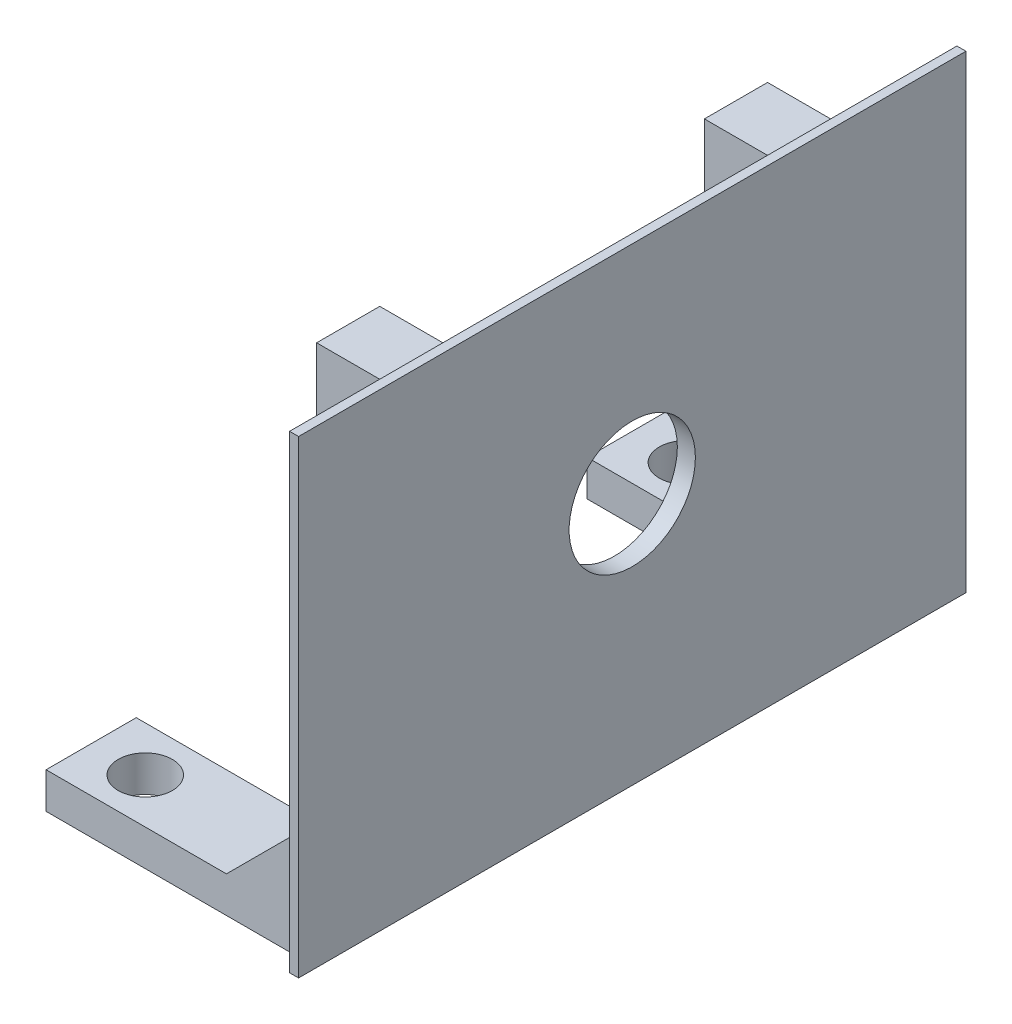
ISO-10303-21;
HEADER;
FILE_DESCRIPTION(('STEP AP214'),'2;1');
FILE_NAME('part.step','',(''),(''),'','','');
FILE_SCHEMA(('AUTOMOTIVE_DESIGN { 1 0 10303 214 1 1 1 1 }'));
ENDSEC;
DATA;
#1=APPLICATION_CONTEXT('core data for automotive mechanical design processes');
#2=APPLICATION_PROTOCOL_DEFINITION('international standard','automotive_design',2000,#1);
#3=PRODUCT_CONTEXT('',#1,'mechanical');
#4=PRODUCT('Part','Part','',(#3));
#5=PRODUCT_RELATED_PRODUCT_CATEGORY('part','',(#4));
#6=PRODUCT_DEFINITION_FORMATION('','',#4);
#7=PRODUCT_DEFINITION_CONTEXT('part definition',#1,'design');
#8=PRODUCT_DEFINITION('design','',#6,#7);
#9=PRODUCT_DEFINITION_SHAPE('','',#8);
#10=(LENGTH_UNIT() NAMED_UNIT(*) SI_UNIT(.MILLI.,.METRE.));
#11=(NAMED_UNIT(*) PLANE_ANGLE_UNIT() SI_UNIT($,.RADIAN.));
#12=(NAMED_UNIT(*) SI_UNIT($,.STERADIAN.) SOLID_ANGLE_UNIT());
#13=UNCERTAINTY_MEASURE_WITH_UNIT(LENGTH_MEASURE(1.E-05),#10,'distance_accuracy_value','');
#14=(GEOMETRIC_REPRESENTATION_CONTEXT(3) GLOBAL_UNCERTAINTY_ASSIGNED_CONTEXT((#13)) GLOBAL_UNIT_ASSIGNED_CONTEXT((#10,
#11,#12)) REPRESENTATION_CONTEXT('',''));
#15=CARTESIAN_POINT('',(0.,0.,0.));
#16=DIRECTION('',(0.,0.,1.));
#17=DIRECTION('',(1.,0.,0.));
#18=AXIS2_PLACEMENT_3D('',#15,#16,#17);
#19=CARTESIAN_POINT('',(1.,0.,-12.5));
#20=DIRECTION('',(0.,0.,-1.));
#21=DIRECTION('',(0.,1.,0.));
#22=AXIS2_PLACEMENT_3D('',#19,#20,#21);
#23=PLANE('',#22);
#24=DIRECTION('',(0.,-1.,0.));
#25=VECTOR('',#24,1.);
#26=CARTESIAN_POINT('',(0.5,25.,-12.5));
#27=LINE('',#26,#25);
#28=CARTESIAN_POINT('',(0.5,24.,-12.5));
#29=VERTEX_POINT('',#28);
#30=CARTESIAN_POINT('',(0.5,5.49999999999998,-12.5));
#31=VERTEX_POINT('',#30);
#32=EDGE_CURVE('E314',#29,#31,#27,.T.);
#33=ORIENTED_EDGE('',*,*,#32,.T.);
#34=DIRECTION('',(-0.707106781186551,-0.707106781186544,0.));
#35=VECTOR('',#34,1.);
#36=CARTESIAN_POINT('',(-1.99999999999999,3.00000000000002,-12.5));
#37=LINE('',#36,#35);
#38=CARTESIAN_POINT('',(-4.,1.,-12.5));
#39=VERTEX_POINT('',#38);
#40=EDGE_CURVE('E271',#31,#39,#37,.T.);
#41=ORIENTED_EDGE('',*,*,#40,.T.);
#42=DIRECTION('',(0.,-1.,0.));
#43=VECTOR('',#42,1.);
#44=CARTESIAN_POINT('',(-4.,25.,-12.5));
#45=LINE('',#44,#43);
#46=CARTESIAN_POINT('',(-4.,24.,-12.5));
#47=VERTEX_POINT('',#46);
#48=EDGE_CURVE('E229',#47,#39,#45,.T.);
#49=ORIENTED_EDGE('',*,*,#48,.F.);
#50=DIRECTION('',(-1.,0.,0.));
#51=VECTOR('',#50,1.);
#52=CARTESIAN_POINT('',(25.5199920063936,24.,-12.5));
#53=LINE('',#52,#51);
#54=EDGE_CURVE('E194',#29,#47,#53,.T.);
#55=ORIENTED_EDGE('',*,*,#54,.F.);
#56=EDGE_LOOP('',(#33,#41,#49,#55));
#57=FACE_BOUND('',#56,.T.);
#58=ADVANCED_FACE('F37',(#57),#23,.T.);
#59=CARTESIAN_POINT('',(1.,0.,-17.5));
#60=DIRECTION('',(0.,0.,1.));
#61=DIRECTION('',(0.,-1.,0.));
#62=AXIS2_PLACEMENT_3D('',#59,#60,#61);
#63=PLANE('',#62);
#64=DIRECTION('',(0.,-1.,0.));
#65=VECTOR('',#64,1.);
#66=CARTESIAN_POINT('',(0.5,-1.,-17.5));
#67=LINE('',#66,#65);
#68=CARTESIAN_POINT('',(0.5,5.49999999999998,-17.5));
#69=VERTEX_POINT('',#68);
#70=CARTESIAN_POINT('',(0.5,-1.,-17.5));
#71=VERTEX_POINT('',#70);
#72=EDGE_CURVE('E358',#69,#71,#67,.T.);
#73=ORIENTED_EDGE('',*,*,#72,.T.);
#74=DIRECTION('',(-1.,0.,0.));
#75=VECTOR('',#74,1.);
#76=CARTESIAN_POINT('',(1.,-1.,-17.5));
#77=LINE('',#76,#75);
#78=CARTESIAN_POINT('',(-14.,-1.,-17.5));
#79=VERTEX_POINT('',#78);
#80=EDGE_CURVE('E252',#71,#79,#77,.T.);
#81=ORIENTED_EDGE('',*,*,#80,.T.);
#82=DIRECTION('',(0.,-1.,0.));
#83=VECTOR('',#82,1.);
#84=CARTESIAN_POINT('',(-14.,-1.,-17.5));
#85=LINE('',#84,#83);
#86=CARTESIAN_POINT('',(-14.,1.,-17.5));
#87=VERTEX_POINT('',#86);
#88=EDGE_CURVE('E351',#87,#79,#85,.T.);
#89=ORIENTED_EDGE('',*,*,#88,.F.);
#90=DIRECTION('',(-1.,0.,0.));
#91=VECTOR('',#90,1.);
#92=CARTESIAN_POINT('',(6.3851648071345,1.,-17.5));
#93=LINE('',#92,#91);
#94=CARTESIAN_POINT('',(-4.00000000000003,1.,-17.5));
#95=VERTEX_POINT('',#94);
#96=EDGE_CURVE('E357',#95,#87,#93,.T.);
#97=ORIENTED_EDGE('',*,*,#96,.F.);
#98=DIRECTION('',(0.707106781186551,0.707106781186544,0.));
#99=VECTOR('',#98,1.);
#100=CARTESIAN_POINT('',(-2.00000000000002,2.99999999999999,-17.5));
#101=LINE('',#100,#99);
#102=EDGE_CURVE('E12',#95,#69,#101,.T.);
#103=ORIENTED_EDGE('',*,*,#102,.T.);
#104=EDGE_LOOP('',(#73,#81,#89,#97,#103));
#105=FACE_BOUND('',#104,.T.);
#106=ADVANCED_FACE('F393',(#105),#63,.F.);
#107=CARTESIAN_POINT('',(1.,25.,0.));
#108=DIRECTION('',(0.,1.,0.));
#109=DIRECTION('',(0.,0.,1.));
#110=AXIS2_PLACEMENT_3D('',#107,#108,#109);
#111=PLANE('',#110);
#112=DIRECTION('',(0.,0.,1.));
#113=VECTOR('',#112,1.);
#114=CARTESIAN_POINT('',(0.5,25.,-12.5));
#115=LINE('',#114,#113);
#116=CARTESIAN_POINT('',(0.5,25.,-18.5));
#117=VERTEX_POINT('',#116);
#118=CARTESIAN_POINT('',(0.5,25.,18.5));
#119=VERTEX_POINT('',#118);
#120=EDGE_CURVE('E322',#117,#119,#115,.T.);
#121=ORIENTED_EDGE('',*,*,#120,.T.);
#122=DIRECTION('',(1.,0.,0.));
#123=VECTOR('',#122,1.);
#124=CARTESIAN_POINT('',(0.5,25.,18.5));
#125=LINE('',#124,#123);
#126=CARTESIAN_POINT('',(1.,25.,18.5));
#127=VERTEX_POINT('',#126);
#128=EDGE_CURVE('E306',#119,#127,#125,.T.);
#129=ORIENTED_EDGE('',*,*,#128,.T.);
#130=DIRECTION('',(0.,0.,-1.));
#131=VECTOR('',#130,1.);
#132=CARTESIAN_POINT('',(1.,25.,0.));
#133=LINE('',#132,#131);
#134=CARTESIAN_POINT('',(1.,25.,-18.5));
#135=VERTEX_POINT('',#134);
#136=EDGE_CURVE('E247',#127,#135,#133,.T.);
#137=ORIENTED_EDGE('',*,*,#136,.T.);
#138=DIRECTION('',(1.,0.,0.));
#139=VECTOR('',#138,1.);
#140=CARTESIAN_POINT('',(0.5,25.,-18.5));
#141=LINE('',#140,#139);
#142=EDGE_CURVE('E327',#117,#135,#141,.T.);
#143=ORIENTED_EDGE('',*,*,#142,.F.);
#144=EDGE_LOOP('',(#121,#129,#137,#143));
#145=FACE_BOUND('',#144,.T.);
#146=ADVANCED_FACE('F399',(#145),#111,.T.);
#147=CARTESIAN_POINT('',(1.,0.,12.5));
#148=DIRECTION('',(0.,0.,-1.));
#149=DIRECTION('',(0.,1.,0.));
#150=AXIS2_PLACEMENT_3D('',#147,#148,#149);
#151=PLANE('',#150);
#152=DIRECTION('',(0.,1.,0.));
#153=VECTOR('',#152,1.);
#154=CARTESIAN_POINT('',(-4.,25.,12.5));
#155=LINE('',#154,#153);
#156=CARTESIAN_POINT('',(-4.,1.,12.5));
#157=VERTEX_POINT('',#156);
#158=CARTESIAN_POINT('',(-4.,24.,12.5));
#159=VERTEX_POINT('',#158);
#160=EDGE_CURVE('E189',#157,#159,#155,.T.);
#161=ORIENTED_EDGE('',*,*,#160,.F.);
#162=DIRECTION('',(0.707106781186551,0.707106781186544,0.));
#163=VECTOR('',#162,1.);
#164=CARTESIAN_POINT('',(-4.00000000000004,1.,12.5));
#165=LINE('',#164,#163);
#166=CARTESIAN_POINT('',(0.5,5.49999999999999,12.5));
#167=VERTEX_POINT('',#166);
#168=EDGE_CURVE('E263',#157,#167,#165,.T.);
#169=ORIENTED_EDGE('',*,*,#168,.T.);
#170=DIRECTION('',(0.,1.,0.));
#171=VECTOR('',#170,1.);
#172=CARTESIAN_POINT('',(0.5,25.,12.5));
#173=LINE('',#172,#171);
#174=CARTESIAN_POINT('',(0.5,24.,12.5));
#175=VERTEX_POINT('',#174);
#176=EDGE_CURVE('E192',#167,#175,#173,.T.);
#177=ORIENTED_EDGE('',*,*,#176,.T.);
#178=DIRECTION('',(-1.,0.,0.));
#179=VECTOR('',#178,1.);
#180=CARTESIAN_POINT('',(25.5199920063936,24.,12.5));
#181=LINE('',#180,#179);
#182=EDGE_CURVE('E177',#175,#159,#181,.T.);
#183=ORIENTED_EDGE('',*,*,#182,.T.);
#184=EDGE_LOOP('',(#161,#169,#177,#183));
#185=FACE_BOUND('',#184,.T.);
#186=ADVANCED_FACE('F188',(#185),#151,.F.);
#187=CARTESIAN_POINT('',(1.,0.,17.5));
#188=DIRECTION('',(0.,0.,1.));
#189=DIRECTION('',(0.,-1.,0.));
#190=AXIS2_PLACEMENT_3D('',#187,#188,#189);
#191=PLANE('',#190);
#192=DIRECTION('',(-1.,0.,0.));
#193=VECTOR('',#192,1.);
#194=CARTESIAN_POINT('',(1.,-1.,17.5));
#195=LINE('',#194,#193);
#196=CARTESIAN_POINT('',(0.5,-1.,17.5));
#197=VERTEX_POINT('',#196);
#198=CARTESIAN_POINT('',(-14.,-0.999999999999996,17.5));
#199=VERTEX_POINT('',#198);
#200=EDGE_CURVE('E257',#197,#199,#195,.T.);
#201=ORIENTED_EDGE('',*,*,#200,.F.);
#202=DIRECTION('',(0.,1.,0.));
#203=VECTOR('',#202,1.);
#204=CARTESIAN_POINT('',(0.5,1.,17.5));
#205=LINE('',#204,#203);
#206=CARTESIAN_POINT('',(0.5,5.49999999999999,17.5));
#207=VERTEX_POINT('',#206);
#208=EDGE_CURVE('E58',#197,#207,#205,.T.);
#209=ORIENTED_EDGE('',*,*,#208,.T.);
#210=DIRECTION('',(-0.707106781186551,-0.707106781186544,0.));
#211=VECTOR('',#210,1.);
#212=CARTESIAN_POINT('',(-4.00000000000004,1.,17.5));
#213=LINE('',#212,#211);
#214=CARTESIAN_POINT('',(-4.00000000000004,1.,17.5));
#215=VERTEX_POINT('',#214);
#216=EDGE_CURVE('E45',#207,#215,#213,.T.);
#217=ORIENTED_EDGE('',*,*,#216,.T.);
#218=DIRECTION('',(-1.,0.,0.));
#219=VECTOR('',#218,1.);
#220=CARTESIAN_POINT('',(6.3851648071345,1.,17.5));
#221=LINE('',#220,#219);
#222=CARTESIAN_POINT('',(-14.,1.,17.5));
#223=VERTEX_POINT('',#222);
#224=EDGE_CURVE('E276',#215,#223,#221,.T.);
#225=ORIENTED_EDGE('',*,*,#224,.T.);
#226=DIRECTION('',(0.,1.,0.));
#227=VECTOR('',#226,1.);
#228=CARTESIAN_POINT('',(-14.,1.,17.5));
#229=LINE('',#228,#227);
#230=EDGE_CURVE('E330',#199,#223,#229,.T.);
#231=ORIENTED_EDGE('',*,*,#230,.F.);
#232=EDGE_LOOP('',(#201,#209,#217,#225,#231));
#233=FACE_BOUND('',#232,.T.);
#234=ADVANCED_FACE('F274',(#233),#191,.T.);
#235=CARTESIAN_POINT('',(1.,-1.,0.));
#236=DIRECTION('',(0.,1.,0.));
#237=DIRECTION('',(0.,0.,1.));
#238=AXIS2_PLACEMENT_3D('',#235,#236,#237);
#239=PLANE('',#238);
#240=CARTESIAN_POINT('',(-11.,-1.,-15.));
#241=DIRECTION('',(0.,1.,0.));
#242=DIRECTION('',(0.,0.,1.));
#243=AXIS2_PLACEMENT_3D('',#240,#241,#242);
#244=CIRCLE('',#243,1.5);
#245=CARTESIAN_POINT('',(-11.,-1.,-13.5));
#246=VERTEX_POINT('',#245);
#247=EDGE_CURVE('E521',#246,#246,#244,.T.);
#248=ORIENTED_EDGE('',*,*,#247,.T.);
#249=EDGE_LOOP('',(#248));
#250=FACE_BOUND('',#249,.T.);
#251=CARTESIAN_POINT('',(-11.,-1.,15.));
#252=DIRECTION('',(0.,1.,0.));
#253=DIRECTION('',(0.,0.,1.));
#254=AXIS2_PLACEMENT_3D('',#251,#252,#253);
#255=CIRCLE('',#254,1.5);
#256=CARTESIAN_POINT('',(-11.,-1.,16.5));
#257=VERTEX_POINT('',#256);
#258=EDGE_CURVE('E184',#257,#257,#255,.T.);
#259=ORIENTED_EDGE('',*,*,#258,.T.);
#260=EDGE_LOOP('',(#259));
#261=FACE_BOUND('',#260,.T.);
#262=DIRECTION('',(1.,0.,0.));
#263=VECTOR('',#262,1.);
#264=CARTESIAN_POINT('',(0.5,-1.,-18.5));
#265=LINE('',#264,#263);
#266=CARTESIAN_POINT('',(0.5,-1.,-18.5));
#267=VERTEX_POINT('',#266);
#268=CARTESIAN_POINT('',(1.,-1.,-18.5));
#269=VERTEX_POINT('',#268);
#270=EDGE_CURVE('E324',#267,#269,#265,.T.);
#271=ORIENTED_EDGE('',*,*,#270,.T.);
#272=DIRECTION('',(0.,0.,-1.));
#273=VECTOR('',#272,1.);
#274=CARTESIAN_POINT('',(1.,-1.,0.));
#275=LINE('',#274,#273);
#276=CARTESIAN_POINT('',(1.,-1.,18.5));
#277=VERTEX_POINT('',#276);
#278=EDGE_CURVE('E250',#277,#269,#275,.T.);
#279=ORIENTED_EDGE('',*,*,#278,.F.);
#280=DIRECTION('',(1.,0.,0.));
#281=VECTOR('',#280,1.);
#282=CARTESIAN_POINT('',(0.5,-1.,18.5));
#283=LINE('',#282,#281);
#284=CARTESIAN_POINT('',(0.5,-1.,18.5));
#285=VERTEX_POINT('',#284);
#286=EDGE_CURVE('E308',#285,#277,#283,.T.);
#287=ORIENTED_EDGE('',*,*,#286,.F.);
#288=DIRECTION('',(0.,0.,-1.));
#289=VECTOR('',#288,1.);
#290=CARTESIAN_POINT('',(0.5,-1.,12.5));
#291=LINE('',#290,#289);
#292=EDGE_CURVE('E297',#285,#197,#291,.T.);
#293=ORIENTED_EDGE('',*,*,#292,.T.);
#294=ORIENTED_EDGE('',*,*,#200,.T.);
#295=DIRECTION('',(0.,0.,1.));
#296=VECTOR('',#295,1.);
#297=CARTESIAN_POINT('',(-14.,-0.999999999999996,17.5));
#298=LINE('',#297,#296);
#299=CARTESIAN_POINT('',(-14.,-1.,12.5));
#300=VERTEX_POINT('',#299);
#301=EDGE_CURVE('E338',#300,#199,#298,.T.);
#302=ORIENTED_EDGE('',*,*,#301,.F.);
#303=DIRECTION('',(-1.,0.,0.));
#304=VECTOR('',#303,1.);
#305=CARTESIAN_POINT('',(6.3851648071345,-1.,12.5));
#306=LINE('',#305,#304);
#307=CARTESIAN_POINT('',(-4.,-1.,12.5));
#308=VERTEX_POINT('',#307);
#309=EDGE_CURVE('E343',#308,#300,#306,.T.);
#310=ORIENTED_EDGE('',*,*,#309,.F.);
#311=DIRECTION('',(0.,0.,1.));
#312=VECTOR('',#311,1.);
#313=CARTESIAN_POINT('',(-4.,-1.,12.5));
#314=LINE('',#313,#312);
#315=CARTESIAN_POINT('',(-4.,-1.,9.));
#316=VERTEX_POINT('',#315);
#317=EDGE_CURVE('E211',#316,#308,#314,.T.);
#318=ORIENTED_EDGE('',*,*,#317,.F.);
#319=DIRECTION('',(1.,0.,0.));
#320=VECTOR('',#319,1.);
#321=CARTESIAN_POINT('',(-4.,-1.,9.));
#322=LINE('',#321,#320);
#323=CARTESIAN_POINT('',(0.,-1.,9.));
#324=VERTEX_POINT('',#323);
#325=EDGE_CURVE('E212',#316,#324,#322,.T.);
#326=ORIENTED_EDGE('',*,*,#325,.T.);
#327=DIRECTION('',(0.,0.,-1.));
#328=VECTOR('',#327,1.);
#329=CARTESIAN_POINT('',(0.,-1.,0.));
#330=LINE('',#329,#328);
#331=CARTESIAN_POINT('',(0.,-1.,-9.));
#332=VERTEX_POINT('',#331);
#333=EDGE_CURVE('E248',#324,#332,#330,.T.);
#334=ORIENTED_EDGE('',*,*,#333,.T.);
#335=DIRECTION('',(1.,0.,0.));
#336=VECTOR('',#335,1.);
#337=CARTESIAN_POINT('',(-4.,-1.,-9.));
#338=LINE('',#337,#336);
#339=CARTESIAN_POINT('',(-4.,-1.,-9.));
#340=VERTEX_POINT('',#339);
#341=EDGE_CURVE('E238',#340,#332,#338,.T.);
#342=ORIENTED_EDGE('',*,*,#341,.F.);
#343=DIRECTION('',(0.,0.,1.));
#344=VECTOR('',#343,1.);
#345=CARTESIAN_POINT('',(-4.,-1.,-12.5));
#346=LINE('',#345,#344);
#347=CARTESIAN_POINT('',(-4.,-1.,-12.5));
#348=VERTEX_POINT('',#347);
#349=EDGE_CURVE('E232',#348,#340,#346,.T.);
#350=ORIENTED_EDGE('',*,*,#349,.F.);
#351=DIRECTION('',(-1.,0.,0.));
#352=VECTOR('',#351,1.);
#353=CARTESIAN_POINT('',(6.3851648071345,-1.,-12.5));
#354=LINE('',#353,#352);
#355=CARTESIAN_POINT('',(-14.,-1.,-12.5));
#356=VERTEX_POINT('',#355);
#357=EDGE_CURVE('E360',#348,#356,#354,.T.);
#358=ORIENTED_EDGE('',*,*,#357,.T.);
#359=DIRECTION('',(0.,0.,1.));
#360=VECTOR('',#359,1.);
#361=CARTESIAN_POINT('',(-14.,-1.,-12.5));
#362=LINE('',#361,#360);
#363=EDGE_CURVE('E354',#79,#356,#362,.T.);
#364=ORIENTED_EDGE('',*,*,#363,.F.);
#365=ORIENTED_EDGE('',*,*,#80,.F.);
#366=DIRECTION('',(0.,0.,-1.));
#367=VECTOR('',#366,1.);
#368=CARTESIAN_POINT('',(0.5,-1.,-12.5));
#369=LINE('',#368,#367);
#370=EDGE_CURVE('E317',#71,#267,#369,.T.);
#371=ORIENTED_EDGE('',*,*,#370,.T.);
#372=EDGE_LOOP('',(#271,#279,#287,#293,#294,#302,#310,#318,#326,#334,#342,#350,#358,#364,#365,#371));
#373=FACE_BOUND('',#372,.T.);
#374=ADVANCED_FACE('F408',(#250,#261,#373),#239,.F.);
#375=CARTESIAN_POINT('',(1.,13.,0.));
#376=DIRECTION('',(-1.,0.,0.));
#377=DIRECTION('',(0.,0.,1.));
#378=AXIS2_PLACEMENT_3D('',#375,#376,#377);
#379=CYLINDRICAL_SURFACE('',#378,3.5);
#380=CARTESIAN_POINT('',(1.,13.,0.));
#381=DIRECTION('',(1.,0.,0.));
#382=DIRECTION('',(0.,0.,-1.));
#383=AXIS2_PLACEMENT_3D('',#380,#381,#382);
#384=CIRCLE('',#383,3.5);
#385=CARTESIAN_POINT('',(1.,13.,-3.5));
#386=VERTEX_POINT('',#385);
#387=EDGE_CURVE('E244',#386,#386,#384,.T.);
#388=ORIENTED_EDGE('',*,*,#387,.T.);
#389=EDGE_LOOP('',(#388));
#390=FACE_BOUND('',#389,.T.);
#391=CARTESIAN_POINT('',(0.,13.,0.));
#392=DIRECTION('',(1.,0.,0.));
#393=DIRECTION('',(0.,0.,-1.));
#394=AXIS2_PLACEMENT_3D('',#391,#392,#393);
#395=CIRCLE('',#394,3.5);
#396=CARTESIAN_POINT('',(0.,13.,-3.5));
#397=VERTEX_POINT('',#396);
#398=EDGE_CURVE('E243',#397,#397,#395,.T.);
#399=ORIENTED_EDGE('',*,*,#398,.F.);
#400=EDGE_LOOP('',(#399));
#401=FACE_BOUND('',#400,.T.);
#402=ADVANCED_FACE('F405',(#390,#401),#379,.F.);
#403=CARTESIAN_POINT('',(1.,0.,0.));
#404=DIRECTION('',(1.,0.,0.));
#405=DIRECTION('',(0.,0.,-1.));
#406=AXIS2_PLACEMENT_3D('',#403,#404,#405);
#407=PLANE('',#406);
#408=DIRECTION('',(0.,-1.,0.));
#409=VECTOR('',#408,1.);
#410=CARTESIAN_POINT('',(1.,25.,18.5));
#411=LINE('',#410,#409);
#412=EDGE_CURVE('E294',#127,#277,#411,.T.);
#413=ORIENTED_EDGE('',*,*,#412,.T.);
#414=ORIENTED_EDGE('',*,*,#278,.T.);
#415=DIRECTION('',(0.,1.,0.));
#416=VECTOR('',#415,1.);
#417=CARTESIAN_POINT('',(1.,25.,-18.5));
#418=LINE('',#417,#416);
#419=EDGE_CURVE('E311',#269,#135,#418,.T.);
#420=ORIENTED_EDGE('',*,*,#419,.T.);
#421=ORIENTED_EDGE('',*,*,#136,.F.);
#422=EDGE_LOOP('',(#413,#414,#420,#421));
#423=FACE_BOUND('',#422,.T.);
#424=ORIENTED_EDGE('',*,*,#387,.F.);
#425=EDGE_LOOP('',(#424));
#426=FACE_BOUND('',#425,.T.);
#427=ADVANCED_FACE('F407',(#423,#426),#407,.T.);
#428=CARTESIAN_POINT('',(0.,0.,0.));
#429=DIRECTION('',(1.,0.,0.));
#430=DIRECTION('',(0.,0.,-1.));
#431=AXIS2_PLACEMENT_3D('',#428,#429,#430);
#432=PLANE('',#431);
#433=DIRECTION('',(0.,-1.,0.));
#434=VECTOR('',#433,1.);
#435=CARTESIAN_POINT('',(0.,25.,9.));
#436=LINE('',#435,#434);
#437=CARTESIAN_POINT('',(0.,24.,9.));
#438=VERTEX_POINT('',#437);
#439=EDGE_CURVE('E201',#438,#324,#436,.T.);
#440=ORIENTED_EDGE('',*,*,#439,.F.);
#441=DIRECTION('',(0.,0.,-1.));
#442=VECTOR('',#441,1.);
#443=CARTESIAN_POINT('',(0.,24.,0.));
#444=LINE('',#443,#442);
#445=CARTESIAN_POINT('',(0.,24.,-9.));
#446=VERTEX_POINT('',#445);
#447=EDGE_CURVE('E508',#438,#446,#444,.T.);
#448=ORIENTED_EDGE('',*,*,#447,.T.);
#449=DIRECTION('',(0.,1.,0.));
#450=VECTOR('',#449,1.);
#451=CARTESIAN_POINT('',(0.,25.,-9.));
#452=LINE('',#451,#450);
#453=EDGE_CURVE('E226',#332,#446,#452,.T.);
#454=ORIENTED_EDGE('',*,*,#453,.F.);
#455=ORIENTED_EDGE('',*,*,#333,.F.);
#456=EDGE_LOOP('',(#440,#448,#454,#455));
#457=FACE_BOUND('',#456,.T.);
#458=ORIENTED_EDGE('',*,*,#398,.T.);
#459=EDGE_LOOP('',(#458));
#460=FACE_BOUND('',#459,.T.);
#461=ADVANCED_FACE('F505',(#457,#460),#432,.F.);
#462=CARTESIAN_POINT('',(-4.,0.,0.));
#463=DIRECTION('',(-1.,0.,0.));
#464=DIRECTION('',(0.,0.,1.));
#465=AXIS2_PLACEMENT_3D('',#462,#463,#464);
#466=PLANE('',#465);
#467=DIRECTION('',(0.,0.,1.));
#468=VECTOR('',#467,1.);
#469=CARTESIAN_POINT('',(-4.,24.,-12.5));
#470=LINE('',#469,#468);
#471=CARTESIAN_POINT('',(-4.,24.,-9.));
#472=VERTEX_POINT('',#471);
#473=EDGE_CURVE('E183',#47,#472,#470,.T.);
#474=ORIENTED_EDGE('',*,*,#473,.F.);
#475=ORIENTED_EDGE('',*,*,#48,.T.);
#476=EDGE_CURVE('E233',#39,#348,#45,.T.);
#477=ORIENTED_EDGE('',*,*,#476,.T.);
#478=ORIENTED_EDGE('',*,*,#349,.T.);
#479=DIRECTION('',(0.,1.,0.));
#480=VECTOR('',#479,1.);
#481=CARTESIAN_POINT('',(-4.,25.,-9.));
#482=LINE('',#481,#480);
#483=EDGE_CURVE('E235',#340,#472,#482,.T.);
#484=ORIENTED_EDGE('',*,*,#483,.T.);
#485=EDGE_LOOP('',(#474,#475,#477,#478,#484));
#486=FACE_BOUND('',#485,.T.);
#487=CARTESIAN_POINT('',(-4.,14.,-10.75));
#488=DIRECTION('',(-1.,0.,0.));
#489=DIRECTION('',(0.,0.,1.));
#490=AXIS2_PLACEMENT_3D('',#487,#488,#489);
#491=CIRCLE('',#490,0.75);
#492=CARTESIAN_POINT('',(-4.,14.,-10.));
#493=VERTEX_POINT('',#492);
#494=EDGE_CURVE('E223',#493,#493,#491,.T.);
#495=ORIENTED_EDGE('',*,*,#494,.F.);
#496=EDGE_LOOP('',(#495));
#497=FACE_BOUND('',#496,.T.);
#498=CARTESIAN_POINT('',(-4.,1.5,-10.75));
#499=DIRECTION('',(-1.,0.,0.));
#500=DIRECTION('',(0.,0.,1.));
#501=AXIS2_PLACEMENT_3D('',#498,#499,#500);
#502=CIRCLE('',#501,0.75);
#503=CARTESIAN_POINT('',(-4.,1.5,-10.));
#504=VERTEX_POINT('',#503);
#505=EDGE_CURVE('E217',#504,#504,#502,.T.);
#506=ORIENTED_EDGE('',*,*,#505,.F.);
#507=EDGE_LOOP('',(#506));
#508=FACE_BOUND('',#507,.T.);
#509=ADVANCED_FACE('F476',(#486,#497,#508),#466,.T.);
#510=CARTESIAN_POINT('',(-4.,25.,-9.));
#511=DIRECTION('',(0.,0.,-1.));
#512=DIRECTION('',(0.,1.,0.));
#513=AXIS2_PLACEMENT_3D('',#510,#511,#512);
#514=PLANE('',#513);
#515=ORIENTED_EDGE('',*,*,#453,.T.);
#516=DIRECTION('',(-1.,0.,0.));
#517=VECTOR('',#516,1.);
#518=CARTESIAN_POINT('',(-4.,24.,-9.));
#519=LINE('',#518,#517);
#520=EDGE_CURVE('E300',#446,#472,#519,.T.);
#521=ORIENTED_EDGE('',*,*,#520,.T.);
#522=ORIENTED_EDGE('',*,*,#483,.F.);
#523=ORIENTED_EDGE('',*,*,#341,.T.);
#524=EDGE_LOOP('',(#515,#521,#522,#523));
#525=FACE_BOUND('',#524,.T.);
#526=ADVANCED_FACE('F512',(#525),#514,.F.);
#527=CARTESIAN_POINT('',(-4.,14.,-10.75));
#528=DIRECTION('',(1.,0.,0.));
#529=DIRECTION('',(0.,0.,-1.));
#530=AXIS2_PLACEMENT_3D('',#527,#528,#529);
#531=CYLINDRICAL_SURFACE('',#530,0.75);
#532=ORIENTED_EDGE('',*,*,#494,.T.);
#533=EDGE_LOOP('',(#532));
#534=FACE_BOUND('',#533,.T.);
#535=CARTESIAN_POINT('',(0.,14.,-10.75));
#536=DIRECTION('',(-1.,0.,0.));
#537=DIRECTION('',(0.,0.,1.));
#538=AXIS2_PLACEMENT_3D('',#535,#536,#537);
#539=CIRCLE('',#538,0.75);
#540=CARTESIAN_POINT('',(0.,14.,-10.));
#541=VERTEX_POINT('',#540);
#542=EDGE_CURVE('E220',#541,#541,#539,.T.);
#543=ORIENTED_EDGE('',*,*,#542,.F.);
#544=EDGE_LOOP('',(#543));
#545=FACE_BOUND('',#544,.T.);
#546=ADVANCED_FACE('F706',(#534,#545),#531,.F.);
#547=CARTESIAN_POINT('',(-4.,1.5,-10.75));
#548=DIRECTION('',(1.,0.,0.));
#549=DIRECTION('',(0.,0.,-1.));
#550=AXIS2_PLACEMENT_3D('',#547,#548,#549);
#551=CYLINDRICAL_SURFACE('',#550,0.75);
#552=ORIENTED_EDGE('',*,*,#505,.T.);
#553=EDGE_LOOP('',(#552));
#554=FACE_BOUND('',#553,.T.);
#555=CARTESIAN_POINT('',(0.,1.5,-10.75));
#556=DIRECTION('',(-1.,0.,0.));
#557=DIRECTION('',(0.,0.,1.));
#558=AXIS2_PLACEMENT_3D('',#555,#556,#557);
#559=CIRCLE('',#558,0.75);
#560=CARTESIAN_POINT('',(0.,1.5,-10.));
#561=VERTEX_POINT('',#560);
#562=EDGE_CURVE('E216',#561,#561,#559,.T.);
#563=ORIENTED_EDGE('',*,*,#562,.F.);
#564=EDGE_LOOP('',(#563));
#565=FACE_BOUND('',#564,.T.);
#566=ADVANCED_FACE('F755',(#554,#565),#551,.F.);
#567=ORIENTED_EDGE('',*,*,#542,.T.);
#568=EDGE_LOOP('',(#567));
#569=FACE_BOUND('',#568,.T.);
#570=ADVANCED_FACE('F460',(#569),#432,.F.);
#571=ORIENTED_EDGE('',*,*,#562,.T.);
#572=EDGE_LOOP('',(#571));
#573=FACE_BOUND('',#572,.T.);
#574=ADVANCED_FACE('F597',(#573),#432,.F.);
#575=CARTESIAN_POINT('',(-4.,0.,0.));
#576=DIRECTION('',(1.,0.,0.));
#577=DIRECTION('',(0.,0.,-1.));
#578=AXIS2_PLACEMENT_3D('',#575,#576,#577);
#579=PLANE('',#578);
#580=ORIENTED_EDGE('',*,*,#160,.T.);
#581=CARTESIAN_POINT('',(-4.,24.,9.));
#582=VERTEX_POINT('',#581);
#583=EDGE_CURVE('E174',#582,#159,#470,.T.);
#584=ORIENTED_EDGE('',*,*,#583,.F.);
#585=DIRECTION('',(0.,-1.,0.));
#586=VECTOR('',#585,1.);
#587=CARTESIAN_POINT('',(-4.,25.,9.));
#588=LINE('',#587,#586);
#589=EDGE_CURVE('E203',#582,#316,#588,.T.);
#590=ORIENTED_EDGE('',*,*,#589,.T.);
#591=ORIENTED_EDGE('',*,*,#317,.T.);
#592=EDGE_CURVE('E200',#308,#157,#155,.T.);
#593=ORIENTED_EDGE('',*,*,#592,.T.);
#594=EDGE_LOOP('',(#580,#584,#590,#591,#593));
#595=FACE_BOUND('',#594,.T.);
#596=CARTESIAN_POINT('',(-4.,1.5,10.75));
#597=DIRECTION('',(-1.,0.,0.));
#598=DIRECTION('',(0.,0.,1.));
#599=AXIS2_PLACEMENT_3D('',#596,#597,#598);
#600=CIRCLE('',#599,0.75);
#601=CARTESIAN_POINT('',(-4.,1.5,11.5));
#602=VERTEX_POINT('',#601);
#603=EDGE_CURVE('E204',#602,#602,#600,.T.);
#604=ORIENTED_EDGE('',*,*,#603,.F.);
#605=EDGE_LOOP('',(#604));
#606=FACE_BOUND('',#605,.T.);
#607=CARTESIAN_POINT('',(-4.,14.,10.75));
#608=DIRECTION('',(-1.,0.,0.));
#609=DIRECTION('',(0.,0.,1.));
#610=AXIS2_PLACEMENT_3D('',#607,#608,#609);
#611=CIRCLE('',#610,0.75);
#612=CARTESIAN_POINT('',(-4.,14.,11.5));
#613=VERTEX_POINT('',#612);
#614=EDGE_CURVE('E366',#613,#613,#611,.T.);
#615=ORIENTED_EDGE('',*,*,#614,.F.);
#616=EDGE_LOOP('',(#615));
#617=FACE_BOUND('',#616,.T.);
#618=ADVANCED_FACE('F197',(#595,#606,#617),#579,.F.);
#619=CARTESIAN_POINT('',(-4.,25.,9.));
#620=DIRECTION('',(0.,0.,1.));
#621=DIRECTION('',(0.,-1.,0.));
#622=AXIS2_PLACEMENT_3D('',#619,#620,#621);
#623=PLANE('',#622);
#624=ORIENTED_EDGE('',*,*,#589,.F.);
#625=DIRECTION('',(1.,0.,0.));
#626=VECTOR('',#625,1.);
#627=CARTESIAN_POINT('',(-4.,24.,9.));
#628=LINE('',#627,#626);
#629=EDGE_CURVE('E179',#582,#438,#628,.T.);
#630=ORIENTED_EDGE('',*,*,#629,.T.);
#631=ORIENTED_EDGE('',*,*,#439,.T.);
#632=ORIENTED_EDGE('',*,*,#325,.F.);
#633=EDGE_LOOP('',(#624,#630,#631,#632));
#634=FACE_BOUND('',#633,.T.);
#635=ADVANCED_FACE('F381',(#634),#623,.F.);
#636=CARTESIAN_POINT('',(-4.,1.5,10.75));
#637=DIRECTION('',(1.,0.,0.));
#638=DIRECTION('',(0.,0.,-1.));
#639=AXIS2_PLACEMENT_3D('',#636,#637,#638);
#640=CYLINDRICAL_SURFACE('',#639,0.75);
#641=ORIENTED_EDGE('',*,*,#603,.T.);
#642=EDGE_LOOP('',(#641));
#643=FACE_BOUND('',#642,.T.);
#644=CARTESIAN_POINT('',(0.,1.5,10.75));
#645=DIRECTION('',(-1.,0.,0.));
#646=DIRECTION('',(0.,0.,1.));
#647=AXIS2_PLACEMENT_3D('',#644,#645,#646);
#648=CIRCLE('',#647,0.75);
#649=CARTESIAN_POINT('',(0.,1.5,11.5));
#650=VERTEX_POINT('',#649);
#651=EDGE_CURVE('E208',#650,#650,#648,.T.);
#652=ORIENTED_EDGE('',*,*,#651,.F.);
#653=EDGE_LOOP('',(#652));
#654=FACE_BOUND('',#653,.T.);
#655=ADVANCED_FACE('F378',(#643,#654),#640,.F.);
#656=CARTESIAN_POINT('',(-4.,14.,10.75));
#657=DIRECTION('',(1.,0.,0.));
#658=DIRECTION('',(0.,0.,-1.));
#659=AXIS2_PLACEMENT_3D('',#656,#657,#658);
#660=CYLINDRICAL_SURFACE('',#659,0.75);
#661=ORIENTED_EDGE('',*,*,#614,.T.);
#662=EDGE_LOOP('',(#661));
#663=FACE_BOUND('',#662,.T.);
#664=CARTESIAN_POINT('',(0.,14.,10.75));
#665=DIRECTION('',(-1.,0.,0.));
#666=DIRECTION('',(0.,0.,1.));
#667=AXIS2_PLACEMENT_3D('',#664,#665,#666);
#668=CIRCLE('',#667,0.75);
#669=CARTESIAN_POINT('',(0.,14.,11.5));
#670=VERTEX_POINT('',#669);
#671=EDGE_CURVE('E365',#670,#670,#668,.T.);
#672=ORIENTED_EDGE('',*,*,#671,.F.);
#673=EDGE_LOOP('',(#672));
#674=FACE_BOUND('',#673,.T.);
#675=ADVANCED_FACE('F380',(#663,#674),#660,.F.);
#676=ORIENTED_EDGE('',*,*,#651,.T.);
#677=EDGE_LOOP('',(#676));
#678=FACE_BOUND('',#677,.T.);
#679=ADVANCED_FACE('F376',(#678),#432,.F.);
#680=ORIENTED_EDGE('',*,*,#671,.T.);
#681=EDGE_LOOP('',(#680));
#682=FACE_BOUND('',#681,.T.);
#683=ADVANCED_FACE('F453',(#682),#432,.F.);
#684=CARTESIAN_POINT('',(6.3851648071345,1.,-12.5));
#685=DIRECTION('',(0.,1.,0.));
#686=DIRECTION('',(0.,0.,1.));
#687=AXIS2_PLACEMENT_3D('',#684,#685,#686);
#688=PLANE('',#687);
#689=CARTESIAN_POINT('',(-11.,1.,-15.));
#690=DIRECTION('',(0.,1.,0.));
#691=DIRECTION('',(0.,0.,1.));
#692=AXIS2_PLACEMENT_3D('',#689,#690,#691);
#693=CIRCLE('',#692,1.5);
#694=CARTESIAN_POINT('',(-11.,1.,-13.5));
#695=VERTEX_POINT('',#694);
#696=EDGE_CURVE('E464',#695,#695,#693,.T.);
#697=ORIENTED_EDGE('',*,*,#696,.F.);
#698=EDGE_LOOP('',(#697));
#699=FACE_BOUND('',#698,.T.);
#700=DIRECTION('',(-1.,0.,0.));
#701=VECTOR('',#700,1.);
#702=CARTESIAN_POINT('',(6.3851648071345,1.,-12.5));
#703=LINE('',#702,#701);
#704=CARTESIAN_POINT('',(-14.,1.,-12.5));
#705=VERTEX_POINT('',#704);
#706=EDGE_CURVE('E362',#39,#705,#703,.T.);
#707=ORIENTED_EDGE('',*,*,#706,.F.);
#708=DIRECTION('',(0.,0.,-1.));
#709=VECTOR('',#708,1.);
#710=CARTESIAN_POINT('',(-4.00000000000003,1.,-12.5));
#711=LINE('',#710,#709);
#712=EDGE_CURVE('E269',#39,#95,#711,.T.);
#713=ORIENTED_EDGE('',*,*,#712,.T.);
#714=ORIENTED_EDGE('',*,*,#96,.T.);
#715=DIRECTION('',(0.,0.,-1.));
#716=VECTOR('',#715,1.);
#717=CARTESIAN_POINT('',(-14.,1.,-12.5));
#718=LINE('',#717,#716);
#719=EDGE_CURVE('E348',#705,#87,#718,.T.);
#720=ORIENTED_EDGE('',*,*,#719,.F.);
#721=EDGE_LOOP('',(#707,#713,#714,#720));
#722=FACE_BOUND('',#721,.T.);
#723=ADVANCED_FACE('F450',(#699,#722),#688,.T.);
#724=CARTESIAN_POINT('',(6.3851648071345,-1.,-12.5));
#725=DIRECTION('',(0.,0.,1.));
#726=DIRECTION('',(1.,0.,0.));
#727=AXIS2_PLACEMENT_3D('',#724,#725,#726);
#728=PLANE('',#727);
#729=ORIENTED_EDGE('',*,*,#357,.F.);
#730=ORIENTED_EDGE('',*,*,#476,.F.);
#731=ORIENTED_EDGE('',*,*,#706,.T.);
#732=DIRECTION('',(0.,1.,0.));
#733=VECTOR('',#732,1.);
#734=CARTESIAN_POINT('',(-14.,-1.,-12.5));
#735=LINE('',#734,#733);
#736=EDGE_CURVE('E287',#356,#705,#735,.T.);
#737=ORIENTED_EDGE('',*,*,#736,.F.);
#738=EDGE_LOOP('',(#729,#730,#731,#737));
#739=FACE_BOUND('',#738,.T.);
#740=ADVANCED_FACE('F446',(#739),#728,.T.);
#741=CARTESIAN_POINT('',(-14.,0.,0.));
#742=DIRECTION('',(-1.,0.,0.));
#743=DIRECTION('',(0.,0.,1.));
#744=AXIS2_PLACEMENT_3D('',#741,#742,#743);
#745=PLANE('',#744);
#746=ORIENTED_EDGE('',*,*,#736,.T.);
#747=ORIENTED_EDGE('',*,*,#719,.T.);
#748=ORIENTED_EDGE('',*,*,#88,.T.);
#749=ORIENTED_EDGE('',*,*,#363,.T.);
#750=EDGE_LOOP('',(#746,#747,#748,#749));
#751=FACE_BOUND('',#750,.T.);
#752=ADVANCED_FACE('F439',(#751),#745,.T.);
#753=CARTESIAN_POINT('',(6.3851648071345,1.,12.5));
#754=DIRECTION('',(0.,0.,-1.));
#755=DIRECTION('',(-1.,0.,0.));
#756=AXIS2_PLACEMENT_3D('',#753,#754,#755);
#757=PLANE('',#756);
#758=ORIENTED_EDGE('',*,*,#592,.F.);
#759=ORIENTED_EDGE('',*,*,#309,.T.);
#760=DIRECTION('',(0.,-1.,0.));
#761=VECTOR('',#760,1.);
#762=CARTESIAN_POINT('',(-14.,1.,12.5));
#763=LINE('',#762,#761);
#764=CARTESIAN_POINT('',(-14.,1.,12.5));
#765=VERTEX_POINT('',#764);
#766=EDGE_CURVE('E335',#765,#300,#763,.T.);
#767=ORIENTED_EDGE('',*,*,#766,.F.);
#768=DIRECTION('',(-1.,0.,0.));
#769=VECTOR('',#768,1.);
#770=CARTESIAN_POINT('',(6.3851648071345,1.,12.5));
#771=LINE('',#770,#769);
#772=EDGE_CURVE('E341',#157,#765,#771,.T.);
#773=ORIENTED_EDGE('',*,*,#772,.F.);
#774=EDGE_LOOP('',(#758,#759,#767,#773));
#775=FACE_BOUND('',#774,.T.);
#776=ADVANCED_FACE('F436',(#775),#757,.T.);
#777=CARTESIAN_POINT('',(6.3851648071345,1.,17.5));
#778=DIRECTION('',(0.,1.,0.));
#779=DIRECTION('',(0.,0.,1.));
#780=AXIS2_PLACEMENT_3D('',#777,#778,#779);
#781=PLANE('',#780);
#782=CARTESIAN_POINT('',(-11.,1.,15.));
#783=DIRECTION('',(0.,1.,0.));
#784=DIRECTION('',(0.,0.,1.));
#785=AXIS2_PLACEMENT_3D('',#782,#783,#784);
#786=CIRCLE('',#785,1.5);
#787=CARTESIAN_POINT('',(-11.,1.,16.5));
#788=VERTEX_POINT('',#787);
#789=EDGE_CURVE('E518',#788,#788,#786,.T.);
#790=ORIENTED_EDGE('',*,*,#789,.F.);
#791=EDGE_LOOP('',(#790));
#792=FACE_BOUND('',#791,.T.);
#793=ORIENTED_EDGE('',*,*,#224,.F.);
#794=DIRECTION('',(0.,0.,-1.));
#795=VECTOR('',#794,1.);
#796=CARTESIAN_POINT('',(-4.00000000000004,1.,17.5));
#797=LINE('',#796,#795);
#798=EDGE_CURVE('E260',#215,#157,#797,.T.);
#799=ORIENTED_EDGE('',*,*,#798,.T.);
#800=ORIENTED_EDGE('',*,*,#772,.T.);
#801=DIRECTION('',(0.,0.,-1.));
#802=VECTOR('',#801,1.);
#803=CARTESIAN_POINT('',(-14.,1.,17.5));
#804=LINE('',#803,#802);
#805=EDGE_CURVE('E285',#223,#765,#804,.T.);
#806=ORIENTED_EDGE('',*,*,#805,.F.);
#807=EDGE_LOOP('',(#793,#799,#800,#806));
#808=FACE_BOUND('',#807,.T.);
#809=ADVANCED_FACE('F282',(#792,#808),#781,.T.);
#810=CARTESIAN_POINT('',(-14.,0.,0.));
#811=DIRECTION('',(1.,0.,0.));
#812=DIRECTION('',(0.,0.,-1.));
#813=AXIS2_PLACEMENT_3D('',#810,#811,#812);
#814=PLANE('',#813);
#815=ORIENTED_EDGE('',*,*,#230,.T.);
#816=ORIENTED_EDGE('',*,*,#805,.T.);
#817=ORIENTED_EDGE('',*,*,#766,.T.);
#818=ORIENTED_EDGE('',*,*,#301,.T.);
#819=EDGE_LOOP('',(#815,#816,#817,#818));
#820=FACE_BOUND('',#819,.T.);
#821=ADVANCED_FACE('F429',(#820),#814,.F.);
#822=CARTESIAN_POINT('',(0.5,0.,0.));
#823=DIRECTION('',(1.,0.,0.));
#824=DIRECTION('',(0.,0.,-1.));
#825=AXIS2_PLACEMENT_3D('',#822,#823,#824);
#826=PLANE('',#825);
#827=ORIENTED_EDGE('',*,*,#176,.F.);
#828=DIRECTION('',(0.,0.,1.));
#829=VECTOR('',#828,1.);
#830=CARTESIAN_POINT('',(0.5,5.49999999999998,0.));
#831=LINE('',#830,#829);
#832=EDGE_CURVE('E267',#167,#207,#831,.T.);
#833=ORIENTED_EDGE('',*,*,#832,.T.);
#834=ORIENTED_EDGE('',*,*,#208,.F.);
#835=ORIENTED_EDGE('',*,*,#292,.F.);
#836=DIRECTION('',(0.,-1.,0.));
#837=VECTOR('',#836,1.);
#838=CARTESIAN_POINT('',(0.5,25.,18.5));
#839=LINE('',#838,#837);
#840=EDGE_CURVE('E293',#119,#285,#839,.T.);
#841=ORIENTED_EDGE('',*,*,#840,.F.);
#842=ORIENTED_EDGE('',*,*,#120,.F.);
#843=DIRECTION('',(0.,1.,0.));
#844=VECTOR('',#843,1.);
#845=CARTESIAN_POINT('',(0.5,25.,-18.5));
#846=LINE('',#845,#844);
#847=EDGE_CURVE('E319',#267,#117,#846,.T.);
#848=ORIENTED_EDGE('',*,*,#847,.F.);
#849=ORIENTED_EDGE('',*,*,#370,.F.);
#850=ORIENTED_EDGE('',*,*,#72,.F.);
#851=DIRECTION('',(0.,0.,1.));
#852=VECTOR('',#851,1.);
#853=CARTESIAN_POINT('',(0.5,5.49999999999998,0.));
#854=LINE('',#853,#852);
#855=EDGE_CURVE('E265',#69,#31,#854,.T.);
#856=ORIENTED_EDGE('',*,*,#855,.T.);
#857=ORIENTED_EDGE('',*,*,#32,.F.);
#858=DIRECTION('',(0.,0.,1.));
#859=VECTOR('',#858,1.);
#860=CARTESIAN_POINT('',(0.5,24.,-12.5));
#861=LINE('',#860,#859);
#862=EDGE_CURVE('E195',#29,#175,#861,.T.);
#863=ORIENTED_EDGE('',*,*,#862,.T.);
#864=EDGE_LOOP('',(#827,#833,#834,#835,#841,#842,#848,#849,#850,#856,#857,#863));
#865=FACE_BOUND('',#864,.T.);
#866=ADVANCED_FACE('F291',(#865),#826,.F.);
#867=CARTESIAN_POINT('',(0.5,25.,-18.5));
#868=DIRECTION('',(0.,0.,-1.));
#869=DIRECTION('',(0.,1.,0.));
#870=AXIS2_PLACEMENT_3D('',#867,#868,#869);
#871=PLANE('',#870);
#872=ORIENTED_EDGE('',*,*,#419,.F.);
#873=ORIENTED_EDGE('',*,*,#270,.F.);
#874=ORIENTED_EDGE('',*,*,#847,.T.);
#875=ORIENTED_EDGE('',*,*,#142,.T.);
#876=EDGE_LOOP('',(#872,#873,#874,#875));
#877=FACE_BOUND('',#876,.T.);
#878=ADVANCED_FACE('F421',(#877),#871,.T.);
#879=CARTESIAN_POINT('',(0.5,25.,18.5));
#880=DIRECTION('',(0.,0.,1.));
#881=DIRECTION('',(0.,-1.,0.));
#882=AXIS2_PLACEMENT_3D('',#879,#880,#881);
#883=PLANE('',#882);
#884=ORIENTED_EDGE('',*,*,#412,.F.);
#885=ORIENTED_EDGE('',*,*,#128,.F.);
#886=ORIENTED_EDGE('',*,*,#840,.T.);
#887=ORIENTED_EDGE('',*,*,#286,.T.);
#888=EDGE_LOOP('',(#884,#885,#886,#887));
#889=FACE_BOUND('',#888,.T.);
#890=ADVANCED_FACE('F416',(#889),#883,.T.);
#891=CARTESIAN_POINT('',(25.5199920063936,24.,-12.5));
#892=DIRECTION('',(0.,-1.,0.));
#893=DIRECTION('',(0.,0.,-1.));
#894=AXIS2_PLACEMENT_3D('',#891,#892,#893);
#895=PLANE('',#894);
#896=ORIENTED_EDGE('',*,*,#447,.F.);
#897=ORIENTED_EDGE('',*,*,#629,.F.);
#898=ORIENTED_EDGE('',*,*,#583,.T.);
#899=ORIENTED_EDGE('',*,*,#182,.F.);
#900=ORIENTED_EDGE('',*,*,#862,.F.);
#901=ORIENTED_EDGE('',*,*,#54,.T.);
#902=ORIENTED_EDGE('',*,*,#473,.T.);
#903=ORIENTED_EDGE('',*,*,#520,.F.);
#904=EDGE_LOOP('',(#896,#897,#898,#899,#900,#901,#902,#903));
#905=FACE_BOUND('',#904,.T.);
#906=ADVANCED_FACE('F176',(#905),#895,.F.);
#907=CARTESIAN_POINT('',(-4.00000000000004,1.,17.5));
#908=DIRECTION('',(0.707106781186544,-0.707106781186551,0.));
#909=DIRECTION('',(0.,0.,-1.));
#910=AXIS2_PLACEMENT_3D('',#907,#908,#909);
#911=PLANE('',#910);
#912=ORIENTED_EDGE('',*,*,#216,.F.);
#913=ORIENTED_EDGE('',*,*,#832,.F.);
#914=ORIENTED_EDGE('',*,*,#168,.F.);
#915=ORIENTED_EDGE('',*,*,#798,.F.);
#916=EDGE_LOOP('',(#912,#913,#914,#915));
#917=FACE_BOUND('',#916,.T.);
#918=ADVANCED_FACE('F289',(#917),#911,.F.);
#919=CARTESIAN_POINT('',(-4.00000000000003,1.,-12.5));
#920=DIRECTION('',(0.707106781186544,-0.707106781186551,0.));
#921=DIRECTION('',(0.,0.,-1.));
#922=AXIS2_PLACEMENT_3D('',#919,#920,#921);
#923=PLANE('',#922);
#924=ORIENTED_EDGE('',*,*,#40,.F.);
#925=ORIENTED_EDGE('',*,*,#855,.F.);
#926=ORIENTED_EDGE('',*,*,#102,.F.);
#927=ORIENTED_EDGE('',*,*,#712,.F.);
#928=EDGE_LOOP('',(#924,#925,#926,#927));
#929=FACE_BOUND('',#928,.T.);
#930=ADVANCED_FACE('F39',(#929),#923,.F.);
#931=CARTESIAN_POINT('',(-11.,1.,15.));
#932=DIRECTION('',(0.,1.,0.));
#933=DIRECTION('',(0.,0.,1.));
#934=AXIS2_PLACEMENT_3D('',#931,#932,#933);
#935=CYLINDRICAL_SURFACE('',#934,1.5);
#936=ORIENTED_EDGE('',*,*,#258,.F.);
#937=EDGE_LOOP('',(#936));
#938=FACE_BOUND('',#937,.T.);
#939=ORIENTED_EDGE('',*,*,#789,.T.);
#940=EDGE_LOOP('',(#939));
#941=FACE_BOUND('',#940,.T.);
#942=ADVANCED_FACE('F415',(#938,#941),#935,.F.);
#943=CARTESIAN_POINT('',(-11.,1.,-15.));
#944=DIRECTION('',(0.,1.,0.));
#945=DIRECTION('',(0.,0.,1.));
#946=AXIS2_PLACEMENT_3D('',#943,#944,#945);
#947=CYLINDRICAL_SURFACE('',#946,1.5);
#948=ORIENTED_EDGE('',*,*,#247,.F.);
#949=EDGE_LOOP('',(#948));
#950=FACE_BOUND('',#949,.T.);
#951=ORIENTED_EDGE('',*,*,#696,.T.);
#952=EDGE_LOOP('',(#951));
#953=FACE_BOUND('',#952,.T.);
#954=ADVANCED_FACE('F525',(#950,#953),#947,.F.);
#955=CLOSED_SHELL('',(#58,#106,#146,#186,#234,#374,#402,#427,#461,#509,#526,#546,#566,#570,#574,
#618,#635,#655,#675,#679,#683,#723,#740,#752,#776,#809,#821,#866,#878,#890,#906,#918,#930,#942,#954));
#956=MANIFOLD_SOLID_BREP('B2',#955);
#957=ADVANCED_BREP_SHAPE_REPRESENTATION('',(#18,#956),#14);
#958=SHAPE_DEFINITION_REPRESENTATION(#9,#957);
ENDSEC;
END-ISO-10303-21;
